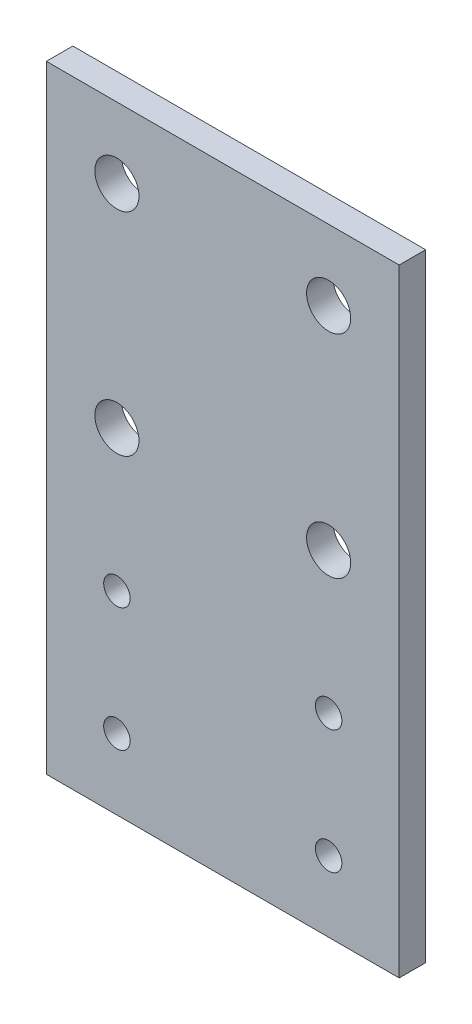
ISO-10303-21;
HEADER;
FILE_DESCRIPTION(('STEP AP214'),'2;1');
FILE_NAME('part.step','',(''),(''),'','','');
FILE_SCHEMA(('AUTOMOTIVE_DESIGN { 1 0 10303 214 1 1 1 1 }'));
ENDSEC;
DATA;
#1=APPLICATION_CONTEXT('core data for automotive mechanical design processes');
#2=APPLICATION_PROTOCOL_DEFINITION('international standard','automotive_design',2000,#1);
#3=PRODUCT_CONTEXT('',#1,'mechanical');
#4=PRODUCT('Part','Part','',(#3));
#5=PRODUCT_RELATED_PRODUCT_CATEGORY('part','',(#4));
#6=PRODUCT_DEFINITION_FORMATION('','',#4);
#7=PRODUCT_DEFINITION_CONTEXT('part definition',#1,'design');
#8=PRODUCT_DEFINITION('design','',#6,#7);
#9=PRODUCT_DEFINITION_SHAPE('','',#8);
#10=(LENGTH_UNIT() NAMED_UNIT(*) SI_UNIT(.MILLI.,.METRE.));
#11=(NAMED_UNIT(*) PLANE_ANGLE_UNIT() SI_UNIT($,.RADIAN.));
#12=(NAMED_UNIT(*) SI_UNIT($,.STERADIAN.) SOLID_ANGLE_UNIT());
#13=UNCERTAINTY_MEASURE_WITH_UNIT(LENGTH_MEASURE(1.E-05),#10,'distance_accuracy_value','');
#14=(GEOMETRIC_REPRESENTATION_CONTEXT(3) GLOBAL_UNCERTAINTY_ASSIGNED_CONTEXT((#13)) GLOBAL_UNIT_ASSIGNED_CONTEXT((#10,
#11,#12)) REPRESENTATION_CONTEXT('',''));
#15=CARTESIAN_POINT('',(0.,0.,0.));
#16=DIRECTION('',(0.,0.,1.));
#17=DIRECTION('',(1.,0.,0.));
#18=AXIS2_PLACEMENT_3D('',#15,#16,#17);
#19=CARTESIAN_POINT('',(-20.,-35.,3.));
#20=DIRECTION('',(1.,0.,0.));
#21=DIRECTION('',(0.,0.,-1.));
#22=AXIS2_PLACEMENT_3D('',#19,#20,#21);
#23=PLANE('',#22);
#24=DIRECTION('',(0.,-1.,0.));
#25=VECTOR('',#24,1.);
#26=CARTESIAN_POINT('',(-20.,-35.,0.));
#27=LINE('',#26,#25);
#28=CARTESIAN_POINT('',(-20.,35.,0.));
#29=VERTEX_POINT('',#28);
#30=CARTESIAN_POINT('',(-20.,-35.,0.));
#31=VERTEX_POINT('',#30);
#32=EDGE_CURVE('E89',#29,#31,#27,.T.);
#33=ORIENTED_EDGE('',*,*,#32,.T.);
#34=DIRECTION('',(0.,0.,-1.));
#35=VECTOR('',#34,1.);
#36=CARTESIAN_POINT('',(-20.,-35.,3.));
#37=LINE('',#36,#35);
#38=CARTESIAN_POINT('',(-20.,-35.,3.));
#39=VERTEX_POINT('',#38);
#40=EDGE_CURVE('E50',#39,#31,#37,.T.);
#41=ORIENTED_EDGE('',*,*,#40,.F.);
#42=DIRECTION('',(0.,-1.,0.));
#43=VECTOR('',#42,1.);
#44=CARTESIAN_POINT('',(-20.,-35.,3.));
#45=LINE('',#44,#43);
#46=CARTESIAN_POINT('',(-20.,35.,3.));
#47=VERTEX_POINT('',#46);
#48=EDGE_CURVE('E98',#47,#39,#45,.T.);
#49=ORIENTED_EDGE('',*,*,#48,.F.);
#50=DIRECTION('',(0.,0.,-1.));
#51=VECTOR('',#50,1.);
#52=CARTESIAN_POINT('',(-20.,35.,3.));
#53=LINE('',#52,#51);
#54=EDGE_CURVE('E11',#47,#29,#53,.T.);
#55=ORIENTED_EDGE('',*,*,#54,.T.);
#56=EDGE_LOOP('',(#33,#41,#49,#55));
#57=FACE_BOUND('',#56,.T.);
#58=ADVANCED_FACE('F43',(#57),#23,.F.);
#59=CARTESIAN_POINT('',(-20.,-35.,3.));
#60=DIRECTION('',(0.,1.,0.));
#61=DIRECTION('',(0.,0.,1.));
#62=AXIS2_PLACEMENT_3D('',#59,#60,#61);
#63=PLANE('',#62);
#64=DIRECTION('',(1.,0.,0.));
#65=VECTOR('',#64,1.);
#66=CARTESIAN_POINT('',(-20.,-35.,0.));
#67=LINE('',#66,#65);
#68=CARTESIAN_POINT('',(20.,-35.,0.));
#69=VERTEX_POINT('',#68);
#70=EDGE_CURVE('E80',#31,#69,#67,.T.);
#71=ORIENTED_EDGE('',*,*,#70,.T.);
#72=DIRECTION('',(0.,0.,-1.));
#73=VECTOR('',#72,1.);
#74=CARTESIAN_POINT('',(20.,-35.,3.));
#75=LINE('',#74,#73);
#76=CARTESIAN_POINT('',(20.,-35.,3.));
#77=VERTEX_POINT('',#76);
#78=EDGE_CURVE('E83',#77,#69,#75,.T.);
#79=ORIENTED_EDGE('',*,*,#78,.F.);
#80=DIRECTION('',(1.,0.,0.));
#81=VECTOR('',#80,1.);
#82=CARTESIAN_POINT('',(-20.,-35.,3.));
#83=LINE('',#82,#81);
#84=EDGE_CURVE('E93',#39,#77,#83,.T.);
#85=ORIENTED_EDGE('',*,*,#84,.F.);
#86=ORIENTED_EDGE('',*,*,#40,.T.);
#87=EDGE_LOOP('',(#71,#79,#85,#86));
#88=FACE_BOUND('',#87,.T.);
#89=ADVANCED_FACE('F81',(#88),#63,.F.);
#90=CARTESIAN_POINT('',(20.,-35.,3.));
#91=DIRECTION('',(-1.,0.,0.));
#92=DIRECTION('',(0.,-1.,0.));
#93=AXIS2_PLACEMENT_3D('',#90,#91,#92);
#94=PLANE('',#93);
#95=DIRECTION('',(0.,1.,0.));
#96=VECTOR('',#95,1.);
#97=CARTESIAN_POINT('',(20.,-35.,0.));
#98=LINE('',#97,#96);
#99=CARTESIAN_POINT('',(20.,35.,0.));
#100=VERTEX_POINT('',#99);
#101=EDGE_CURVE('E88',#69,#100,#98,.T.);
#102=ORIENTED_EDGE('',*,*,#101,.T.);
#103=DIRECTION('',(0.,0.,-1.));
#104=VECTOR('',#103,1.);
#105=CARTESIAN_POINT('',(20.,35.,3.));
#106=LINE('',#105,#104);
#107=CARTESIAN_POINT('',(20.,35.,3.));
#108=VERTEX_POINT('',#107);
#109=EDGE_CURVE('E57',#108,#100,#106,.T.);
#110=ORIENTED_EDGE('',*,*,#109,.F.);
#111=DIRECTION('',(0.,1.,0.));
#112=VECTOR('',#111,1.);
#113=CARTESIAN_POINT('',(20.,70.,3.));
#114=LINE('',#113,#112);
#115=EDGE_CURVE('E65',#77,#108,#114,.T.);
#116=ORIENTED_EDGE('',*,*,#115,.F.);
#117=ORIENTED_EDGE('',*,*,#78,.T.);
#118=EDGE_LOOP('',(#102,#110,#116,#117));
#119=FACE_BOUND('',#118,.T.);
#120=ADVANCED_FACE('F92',(#119),#94,.F.);
#121=CARTESIAN_POINT('',(0.,0.,3.));
#122=DIRECTION('',(0.,0.,1.));
#123=DIRECTION('',(1.,0.,0.));
#124=AXIS2_PLACEMENT_3D('',#121,#122,#123);
#125=PLANE('',#124);
#126=DIRECTION('',(-1.,0.,0.));
#127=VECTOR('',#126,1.);
#128=CARTESIAN_POINT('',(-20.,35.,3.));
#129=LINE('',#128,#127);
#130=EDGE_CURVE('E153',#108,#47,#129,.T.);
#131=ORIENTED_EDGE('',*,*,#130,.T.);
#132=ORIENTED_EDGE('',*,*,#48,.T.);
#133=ORIENTED_EDGE('',*,*,#84,.T.);
#134=ORIENTED_EDGE('',*,*,#115,.T.);
#135=EDGE_LOOP('',(#131,#132,#133,#134));
#136=FACE_BOUND('',#135,.T.);
#137=CARTESIAN_POINT('',(12.,3.,3.));
#138=DIRECTION('',(0.,0.,1.));
#139=DIRECTION('',(1.,0.,0.));
#140=AXIS2_PLACEMENT_3D('',#137,#138,#139);
#141=CIRCLE('',#140,2.5);
#142=CARTESIAN_POINT('',(14.5,3.,3.));
#143=VERTEX_POINT('',#142);
#144=EDGE_CURVE('E123',#143,#143,#141,.T.);
#145=ORIENTED_EDGE('',*,*,#144,.F.);
#146=EDGE_LOOP('',(#145));
#147=FACE_BOUND('',#146,.T.);
#148=CARTESIAN_POINT('',(-12.,-13.,3.));
#149=DIRECTION('',(0.,0.,1.));
#150=DIRECTION('',(1.,0.,0.));
#151=AXIS2_PLACEMENT_3D('',#148,#149,#150);
#152=CIRCLE('',#151,1.5);
#153=CARTESIAN_POINT('',(-10.5,-13.,3.));
#154=VERTEX_POINT('',#153);
#155=EDGE_CURVE('E130',#154,#154,#152,.T.);
#156=ORIENTED_EDGE('',*,*,#155,.F.);
#157=EDGE_LOOP('',(#156));
#158=FACE_BOUND('',#157,.T.);
#159=CARTESIAN_POINT('',(12.,-13.,3.));
#160=DIRECTION('',(0.,0.,1.));
#161=DIRECTION('',(1.,0.,0.));
#162=AXIS2_PLACEMENT_3D('',#159,#160,#161);
#163=CIRCLE('',#162,1.5);
#164=CARTESIAN_POINT('',(13.5,-13.,3.));
#165=VERTEX_POINT('',#164);
#166=EDGE_CURVE('E111',#165,#165,#163,.T.);
#167=ORIENTED_EDGE('',*,*,#166,.F.);
#168=EDGE_LOOP('',(#167));
#169=FACE_BOUND('',#168,.T.);
#170=CARTESIAN_POINT('',(-12.,-27.,3.));
#171=DIRECTION('',(0.,0.,1.));
#172=DIRECTION('',(1.,0.,0.));
#173=AXIS2_PLACEMENT_3D('',#170,#171,#172);
#174=CIRCLE('',#173,1.5);
#175=CARTESIAN_POINT('',(-10.5,-27.,3.));
#176=VERTEX_POINT('',#175);
#177=EDGE_CURVE('E118',#176,#176,#174,.T.);
#178=ORIENTED_EDGE('',*,*,#177,.F.);
#179=EDGE_LOOP('',(#178));
#180=FACE_BOUND('',#179,.T.);
#181=CARTESIAN_POINT('',(-12.,27.,3.));
#182=DIRECTION('',(0.,0.,1.));
#183=DIRECTION('',(1.,0.,0.));
#184=AXIS2_PLACEMENT_3D('',#181,#182,#183);
#185=CIRCLE('',#184,2.5);
#186=CARTESIAN_POINT('',(-9.5,27.,3.));
#187=VERTEX_POINT('',#186);
#188=EDGE_CURVE('E147',#187,#187,#185,.T.);
#189=ORIENTED_EDGE('',*,*,#188,.F.);
#190=EDGE_LOOP('',(#189));
#191=FACE_BOUND('',#190,.T.);
#192=CARTESIAN_POINT('',(12.,27.,3.));
#193=DIRECTION('',(0.,0.,1.));
#194=DIRECTION('',(1.,0.,0.));
#195=AXIS2_PLACEMENT_3D('',#192,#193,#194);
#196=CIRCLE('',#195,2.5);
#197=CARTESIAN_POINT('',(14.5,27.,3.));
#198=VERTEX_POINT('',#197);
#199=EDGE_CURVE('E135',#198,#198,#196,.T.);
#200=ORIENTED_EDGE('',*,*,#199,.F.);
#201=EDGE_LOOP('',(#200));
#202=FACE_BOUND('',#201,.T.);
#203=CARTESIAN_POINT('',(-12.,3.,3.));
#204=DIRECTION('',(0.,0.,1.));
#205=DIRECTION('',(1.,0.,0.));
#206=AXIS2_PLACEMENT_3D('',#203,#204,#205);
#207=CIRCLE('',#206,2.5);
#208=CARTESIAN_POINT('',(-9.5,3.,3.));
#209=VERTEX_POINT('',#208);
#210=EDGE_CURVE('E142',#209,#209,#207,.T.);
#211=ORIENTED_EDGE('',*,*,#210,.F.);
#212=EDGE_LOOP('',(#211));
#213=FACE_BOUND('',#212,.T.);
#214=CARTESIAN_POINT('',(12.,-27.,3.));
#215=DIRECTION('',(0.,0.,1.));
#216=DIRECTION('',(1.,0.,0.));
#217=AXIS2_PLACEMENT_3D('',#214,#215,#216);
#218=CIRCLE('',#217,1.5);
#219=CARTESIAN_POINT('',(13.5,-27.,3.));
#220=VERTEX_POINT('',#219);
#221=EDGE_CURVE('E105',#220,#220,#218,.T.);
#222=ORIENTED_EDGE('',*,*,#221,.F.);
#223=EDGE_LOOP('',(#222));
#224=FACE_BOUND('',#223,.T.);
#225=ADVANCED_FACE('F158',(#136,#147,#158,#169,#180,#191,#202,#213,#224),#125,.T.);
#226=CARTESIAN_POINT('',(0.,0.,0.));
#227=DIRECTION('',(0.,0.,1.));
#228=DIRECTION('',(1.,0.,0.));
#229=AXIS2_PLACEMENT_3D('',#226,#227,#228);
#230=PLANE('',#229);
#231=CARTESIAN_POINT('',(12.,3.,0.));
#232=DIRECTION('',(0.,0.,1.));
#233=DIRECTION('',(1.,0.,0.));
#234=AXIS2_PLACEMENT_3D('',#231,#232,#233);
#235=CIRCLE('',#234,2.5);
#236=CARTESIAN_POINT('',(14.5,3.,0.));
#237=VERTEX_POINT('',#236);
#238=EDGE_CURVE('E126',#237,#237,#235,.T.);
#239=ORIENTED_EDGE('',*,*,#238,.T.);
#240=EDGE_LOOP('',(#239));
#241=FACE_BOUND('',#240,.T.);
#242=CARTESIAN_POINT('',(-12.,-13.,0.));
#243=DIRECTION('',(0.,0.,1.));
#244=DIRECTION('',(1.,0.,0.));
#245=AXIS2_PLACEMENT_3D('',#242,#243,#244);
#246=CIRCLE('',#245,1.5);
#247=CARTESIAN_POINT('',(-10.5,-13.,0.));
#248=VERTEX_POINT('',#247);
#249=EDGE_CURVE('E115',#248,#248,#246,.T.);
#250=ORIENTED_EDGE('',*,*,#249,.T.);
#251=EDGE_LOOP('',(#250));
#252=FACE_BOUND('',#251,.T.);
#253=CARTESIAN_POINT('',(12.,-13.,0.));
#254=DIRECTION('',(0.,0.,1.));
#255=DIRECTION('',(1.,0.,0.));
#256=AXIS2_PLACEMENT_3D('',#253,#254,#255);
#257=CIRCLE('',#256,1.5);
#258=CARTESIAN_POINT('',(13.5,-13.,0.));
#259=VERTEX_POINT('',#258);
#260=EDGE_CURVE('E114',#259,#259,#257,.T.);
#261=ORIENTED_EDGE('',*,*,#260,.T.);
#262=EDGE_LOOP('',(#261));
#263=FACE_BOUND('',#262,.T.);
#264=CARTESIAN_POINT('',(-12.,-27.,0.));
#265=DIRECTION('',(0.,0.,1.));
#266=DIRECTION('',(1.,0.,0.));
#267=AXIS2_PLACEMENT_3D('',#264,#265,#266);
#268=CIRCLE('',#267,1.5);
#269=CARTESIAN_POINT('',(-10.5,-27.,0.));
#270=VERTEX_POINT('',#269);
#271=EDGE_CURVE('E108',#270,#270,#268,.T.);
#272=ORIENTED_EDGE('',*,*,#271,.T.);
#273=EDGE_LOOP('',(#272));
#274=FACE_BOUND('',#273,.T.);
#275=CARTESIAN_POINT('',(-12.,27.,0.));
#276=DIRECTION('',(0.,0.,1.));
#277=DIRECTION('',(1.,0.,0.));
#278=AXIS2_PLACEMENT_3D('',#275,#276,#277);
#279=CIRCLE('',#278,2.5);
#280=CARTESIAN_POINT('',(-9.5,27.,0.));
#281=VERTEX_POINT('',#280);
#282=EDGE_CURVE('E139',#281,#281,#279,.T.);
#283=ORIENTED_EDGE('',*,*,#282,.T.);
#284=EDGE_LOOP('',(#283));
#285=FACE_BOUND('',#284,.T.);
#286=CARTESIAN_POINT('',(12.,27.,0.));
#287=DIRECTION('',(0.,0.,1.));
#288=DIRECTION('',(1.,0.,0.));
#289=AXIS2_PLACEMENT_3D('',#286,#287,#288);
#290=CIRCLE('',#289,2.5);
#291=CARTESIAN_POINT('',(14.5,27.,0.));
#292=VERTEX_POINT('',#291);
#293=EDGE_CURVE('E138',#292,#292,#290,.T.);
#294=ORIENTED_EDGE('',*,*,#293,.T.);
#295=EDGE_LOOP('',(#294));
#296=FACE_BOUND('',#295,.T.);
#297=CARTESIAN_POINT('',(-12.,3.,0.));
#298=DIRECTION('',(0.,0.,1.));
#299=DIRECTION('',(1.,0.,0.));
#300=AXIS2_PLACEMENT_3D('',#297,#298,#299);
#301=CIRCLE('',#300,2.5);
#302=CARTESIAN_POINT('',(-9.5,3.,0.));
#303=VERTEX_POINT('',#302);
#304=EDGE_CURVE('E127',#303,#303,#301,.T.);
#305=ORIENTED_EDGE('',*,*,#304,.T.);
#306=EDGE_LOOP('',(#305));
#307=FACE_BOUND('',#306,.T.);
#308=CARTESIAN_POINT('',(12.,-27.,0.));
#309=DIRECTION('',(0.,0.,1.));
#310=DIRECTION('',(1.,0.,0.));
#311=AXIS2_PLACEMENT_3D('',#308,#309,#310);
#312=CIRCLE('',#311,1.5);
#313=CARTESIAN_POINT('',(13.5,-27.,0.));
#314=VERTEX_POINT('',#313);
#315=EDGE_CURVE('E102',#314,#314,#312,.T.);
#316=ORIENTED_EDGE('',*,*,#315,.T.);
#317=EDGE_LOOP('',(#316));
#318=FACE_BOUND('',#317,.T.);
#319=ORIENTED_EDGE('',*,*,#32,.F.);
#320=DIRECTION('',(-1.,0.,0.));
#321=VECTOR('',#320,1.);
#322=CARTESIAN_POINT('',(-20.,35.,0.));
#323=LINE('',#322,#321);
#324=EDGE_CURVE('E96',#100,#29,#323,.T.);
#325=ORIENTED_EDGE('',*,*,#324,.F.);
#326=ORIENTED_EDGE('',*,*,#101,.F.);
#327=ORIENTED_EDGE('',*,*,#70,.F.);
#328=EDGE_LOOP('',(#319,#325,#326,#327));
#329=FACE_BOUND('',#328,.T.);
#330=ADVANCED_FACE('F95',(#241,#252,#263,#274,#285,#296,#307,#318,#329),#230,.F.);
#331=CARTESIAN_POINT('',(12.,-27.,0.));
#332=DIRECTION('',(0.,0.,1.));
#333=DIRECTION('',(1.,0.,0.));
#334=AXIS2_PLACEMENT_3D('',#331,#332,#333);
#335=CYLINDRICAL_SURFACE('',#334,1.5);
#336=ORIENTED_EDGE('',*,*,#315,.F.);
#337=EDGE_LOOP('',(#336));
#338=FACE_BOUND('',#337,.T.);
#339=ORIENTED_EDGE('',*,*,#221,.T.);
#340=EDGE_LOOP('',(#339));
#341=FACE_BOUND('',#340,.T.);
#342=ADVANCED_FACE('F189',(#338,#341),#335,.F.);
#343=CARTESIAN_POINT('',(-12.,3.,0.));
#344=DIRECTION('',(0.,0.,1.));
#345=DIRECTION('',(1.,0.,0.));
#346=AXIS2_PLACEMENT_3D('',#343,#344,#345);
#347=CYLINDRICAL_SURFACE('',#346,2.5);
#348=ORIENTED_EDGE('',*,*,#304,.F.);
#349=EDGE_LOOP('',(#348));
#350=FACE_BOUND('',#349,.T.);
#351=ORIENTED_EDGE('',*,*,#210,.T.);
#352=EDGE_LOOP('',(#351));
#353=FACE_BOUND('',#352,.T.);
#354=ADVANCED_FACE('F194',(#350,#353),#347,.F.);
#355=CARTESIAN_POINT('',(12.,27.,0.));
#356=DIRECTION('',(0.,0.,1.));
#357=DIRECTION('',(1.,0.,0.));
#358=AXIS2_PLACEMENT_3D('',#355,#356,#357);
#359=CYLINDRICAL_SURFACE('',#358,2.5);
#360=ORIENTED_EDGE('',*,*,#293,.F.);
#361=EDGE_LOOP('',(#360));
#362=FACE_BOUND('',#361,.T.);
#363=ORIENTED_EDGE('',*,*,#199,.T.);
#364=EDGE_LOOP('',(#363));
#365=FACE_BOUND('',#364,.T.);
#366=ADVANCED_FACE('F208',(#362,#365),#359,.F.);
#367=CARTESIAN_POINT('',(-12.,27.,0.));
#368=DIRECTION('',(0.,0.,1.));
#369=DIRECTION('',(1.,0.,0.));
#370=AXIS2_PLACEMENT_3D('',#367,#368,#369);
#371=CYLINDRICAL_SURFACE('',#370,2.5);
#372=ORIENTED_EDGE('',*,*,#282,.F.);
#373=EDGE_LOOP('',(#372));
#374=FACE_BOUND('',#373,.T.);
#375=ORIENTED_EDGE('',*,*,#188,.T.);
#376=EDGE_LOOP('',(#375));
#377=FACE_BOUND('',#376,.T.);
#378=ADVANCED_FACE('F202',(#374,#377),#371,.F.);
#379=CARTESIAN_POINT('',(-12.,-27.,0.));
#380=DIRECTION('',(0.,0.,1.));
#381=DIRECTION('',(1.,0.,0.));
#382=AXIS2_PLACEMENT_3D('',#379,#380,#381);
#383=CYLINDRICAL_SURFACE('',#382,1.5);
#384=ORIENTED_EDGE('',*,*,#271,.F.);
#385=EDGE_LOOP('',(#384));
#386=FACE_BOUND('',#385,.T.);
#387=ORIENTED_EDGE('',*,*,#177,.T.);
#388=EDGE_LOOP('',(#387));
#389=FACE_BOUND('',#388,.T.);
#390=ADVANCED_FACE('F199',(#386,#389),#383,.F.);
#391=CARTESIAN_POINT('',(12.,-13.,0.));
#392=DIRECTION('',(0.,0.,1.));
#393=DIRECTION('',(1.,0.,0.));
#394=AXIS2_PLACEMENT_3D('',#391,#392,#393);
#395=CYLINDRICAL_SURFACE('',#394,1.5);
#396=ORIENTED_EDGE('',*,*,#260,.F.);
#397=EDGE_LOOP('',(#396));
#398=FACE_BOUND('',#397,.T.);
#399=ORIENTED_EDGE('',*,*,#166,.T.);
#400=EDGE_LOOP('',(#399));
#401=FACE_BOUND('',#400,.T.);
#402=ADVANCED_FACE('F196',(#398,#401),#395,.F.);
#403=CARTESIAN_POINT('',(-12.,-13.,0.));
#404=DIRECTION('',(0.,0.,1.));
#405=DIRECTION('',(1.,0.,0.));
#406=AXIS2_PLACEMENT_3D('',#403,#404,#405);
#407=CYLINDRICAL_SURFACE('',#406,1.5);
#408=ORIENTED_EDGE('',*,*,#249,.F.);
#409=EDGE_LOOP('',(#408));
#410=FACE_BOUND('',#409,.T.);
#411=ORIENTED_EDGE('',*,*,#155,.T.);
#412=EDGE_LOOP('',(#411));
#413=FACE_BOUND('',#412,.T.);
#414=ADVANCED_FACE('F174',(#410,#413),#407,.F.);
#415=CARTESIAN_POINT('',(12.,3.,0.));
#416=DIRECTION('',(0.,0.,1.));
#417=DIRECTION('',(1.,0.,0.));
#418=AXIS2_PLACEMENT_3D('',#415,#416,#417);
#419=CYLINDRICAL_SURFACE('',#418,2.5);
#420=ORIENTED_EDGE('',*,*,#238,.F.);
#421=EDGE_LOOP('',(#420));
#422=FACE_BOUND('',#421,.T.);
#423=ORIENTED_EDGE('',*,*,#144,.T.);
#424=EDGE_LOOP('',(#423));
#425=FACE_BOUND('',#424,.T.);
#426=ADVANCED_FACE('F168',(#422,#425),#419,.F.);
#427=CARTESIAN_POINT('',(-20.,35.,3.));
#428=DIRECTION('',(0.,-1.,0.));
#429=DIRECTION('',(0.,0.,-1.));
#430=AXIS2_PLACEMENT_3D('',#427,#428,#429);
#431=PLANE('',#430);
#432=ORIENTED_EDGE('',*,*,#324,.T.);
#433=ORIENTED_EDGE('',*,*,#54,.F.);
#434=ORIENTED_EDGE('',*,*,#130,.F.);
#435=ORIENTED_EDGE('',*,*,#109,.T.);
#436=EDGE_LOOP('',(#432,#433,#434,#435));
#437=FACE_BOUND('',#436,.T.);
#438=ADVANCED_FACE('F166',(#437),#431,.F.);
#439=CLOSED_SHELL('',(#58,#89,#120,#225,#330,#342,#354,#366,#378,#390,#402,#414,#426,#438));
#440=MANIFOLD_SOLID_BREP('B2',#439);
#441=ADVANCED_BREP_SHAPE_REPRESENTATION('',(#18,#440),#14);
#442=SHAPE_DEFINITION_REPRESENTATION(#9,#441);
ENDSEC;
END-ISO-10303-21;
